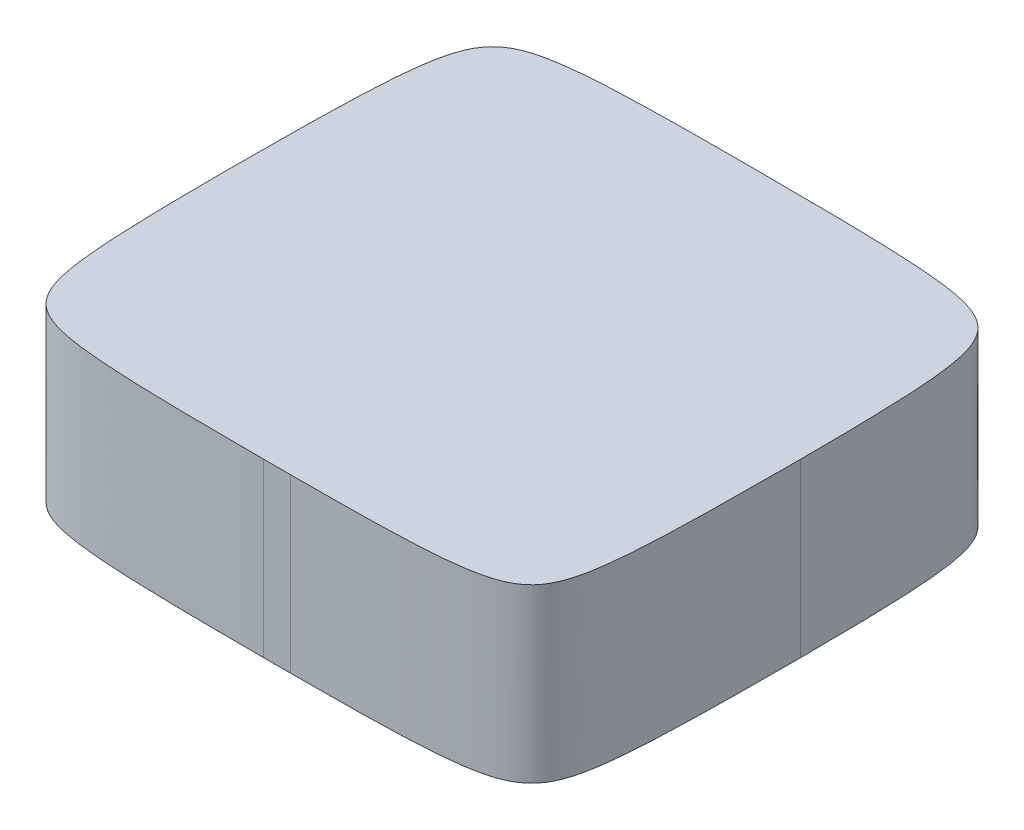
ISO-10303-21;
HEADER;
FILE_DESCRIPTION(('STEP AP214'),'2;1');
FILE_NAME('part.step','',(''),(''),'','','');
FILE_SCHEMA(('AUTOMOTIVE_DESIGN { 1 0 10303 214 1 1 1 1 }'));
ENDSEC;
DATA;
#1=APPLICATION_CONTEXT('core data for automotive mechanical design processes');
#2=APPLICATION_PROTOCOL_DEFINITION('international standard','automotive_design',2000,#1);
#3=PRODUCT_CONTEXT('',#1,'mechanical');
#4=PRODUCT('Part','Part','',(#3));
#5=PRODUCT_RELATED_PRODUCT_CATEGORY('part','',(#4));
#6=PRODUCT_DEFINITION_FORMATION('','',#4);
#7=PRODUCT_DEFINITION_CONTEXT('part definition',#1,'design');
#8=PRODUCT_DEFINITION('design','',#6,#7);
#9=PRODUCT_DEFINITION_SHAPE('','',#8);
#10=(LENGTH_UNIT() NAMED_UNIT(*) SI_UNIT(.MILLI.,.METRE.));
#11=(NAMED_UNIT(*) PLANE_ANGLE_UNIT() SI_UNIT($,.RADIAN.));
#12=(NAMED_UNIT(*) SI_UNIT($,.STERADIAN.) SOLID_ANGLE_UNIT());
#13=UNCERTAINTY_MEASURE_WITH_UNIT(LENGTH_MEASURE(1.E-05),#10,'distance_accuracy_value','');
#14=(GEOMETRIC_REPRESENTATION_CONTEXT(3) GLOBAL_UNCERTAINTY_ASSIGNED_CONTEXT((#13)) GLOBAL_UNIT_ASSIGNED_CONTEXT((#10,
#11,#12)) REPRESENTATION_CONTEXT('',''));
#15=CARTESIAN_POINT('',(0.,0.,0.));
#16=DIRECTION('',(0.,0.,1.));
#17=DIRECTION('',(1.,0.,0.));
#18=AXIS2_PLACEMENT_3D('',#15,#16,#17);
#19=CARTESIAN_POINT('',(0.,25.6,0.));
#20=DIRECTION('',(0.,0.,-1.));
#21=DIRECTION('',(-1.,0.,0.));
#22=AXIS2_PLACEMENT_3D('',#19,#20,#21);
#23=PLANE('',#22);
#24=DIRECTION('',(1.,0.,0.));
#25=VECTOR('',#24,1.);
#26=CARTESIAN_POINT('',(0.,0.,0.));
#27=LINE('',#26,#25);
#28=CARTESIAN_POINT('',(40.,0.,0.));
#29=VERTEX_POINT('',#28);
#30=CARTESIAN_POINT('',(44.,0.,0.));
#31=VERTEX_POINT('',#30);
#32=EDGE_CURVE('E166',#29,#31,#27,.T.);
#33=ORIENTED_EDGE('',*,*,#32,.T.);
#34=CARTESIAN_POINT('',(44.,26.88,0.));
#35=CARTESIAN_POINT('',(44.,17.4933333333333,0.));
#36=CARTESIAN_POINT('',(44.,8.10666666666666,0.));
#37=CARTESIAN_POINT('',(44.,-1.28,0.));
#38=(BOUNDED_CURVE() B_SPLINE_CURVE(3,(#34,#35,#36,#37),.UNSPECIFIED.,.F.,
.F.) B_SPLINE_CURVE_WITH_KNOTS((4,4),(-0.00128,0.02688),
.UNSPECIFIED.) CURVE() GEOMETRIC_REPRESENTATION_ITEM() RATIONAL_B_SPLINE_CURVE((1.,1.,1.,1.)) REPRESENTATION_ITEM(''));
#39=CARTESIAN_POINT('',(44.,25.6,0.));
#40=VERTEX_POINT('',#39);
#41=EDGE_CURVE('E403',#31,#40,#38,.F.);
#42=ORIENTED_EDGE('',*,*,#41,.T.);
#43=DIRECTION('',(1.,0.,0.));
#44=VECTOR('',#43,1.);
#45=CARTESIAN_POINT('',(0.,25.6,0.));
#46=LINE('',#45,#44);
#47=CARTESIAN_POINT('',(40.,25.6,0.));
#48=VERTEX_POINT('',#47);
#49=EDGE_CURVE('E176',#48,#40,#46,.T.);
#50=ORIENTED_EDGE('',*,*,#49,.F.);
#51=CARTESIAN_POINT('',(40.,-1.28,0.));
#52=CARTESIAN_POINT('',(40.,8.10666666666666,0.));
#53=CARTESIAN_POINT('',(40.,17.4933333333333,0.));
#54=CARTESIAN_POINT('',(40.,26.88,0.));
#55=(BOUNDED_CURVE() B_SPLINE_CURVE(3,(#51,#52,#53,#54),.UNSPECIFIED.,.F.,
.F.) B_SPLINE_CURVE_WITH_KNOTS((4,4),(-0.00128,0.02688),
.UNSPECIFIED.) CURVE() GEOMETRIC_REPRESENTATION_ITEM() RATIONAL_B_SPLINE_CURVE((1.,1.,1.,1.)) REPRESENTATION_ITEM(''));
#56=EDGE_CURVE('E192',#48,#29,#55,.F.);
#57=ORIENTED_EDGE('',*,*,#56,.T.);
#58=EDGE_LOOP('',(#33,#42,#50,#57));
#59=FACE_BOUND('',#58,.T.);
#60=ADVANCED_FACE('F41',(#59),#23,.F.);
#61=CARTESIAN_POINT('',(0.,25.6,-74.));
#62=DIRECTION('',(0.,0.,1.));
#63=DIRECTION('',(1.,0.,0.));
#64=AXIS2_PLACEMENT_3D('',#61,#62,#63);
#65=PLANE('',#64);
#66=DIRECTION('',(-1.,0.,0.));
#67=VECTOR('',#66,1.);
#68=CARTESIAN_POINT('',(0.,25.6,-74.));
#69=LINE('',#68,#67);
#70=CARTESIAN_POINT('',(40.,25.6,-74.));
#71=VERTEX_POINT('',#70);
#72=CARTESIAN_POINT('',(36.,25.6,-74.));
#73=VERTEX_POINT('',#72);
#74=EDGE_CURVE('E221',#71,#73,#69,.T.);
#75=ORIENTED_EDGE('',*,*,#74,.F.);
#76=CARTESIAN_POINT('',(40.,-1.28,-74.));
#77=CARTESIAN_POINT('',(40.,8.10666666666666,-74.));
#78=CARTESIAN_POINT('',(40.,17.4933333333333,-74.));
#79=CARTESIAN_POINT('',(40.,26.88,-74.));
#80=(BOUNDED_CURVE() B_SPLINE_CURVE(3,(#76,#77,#78,#79),.UNSPECIFIED.,.F.,
.F.) B_SPLINE_CURVE_WITH_KNOTS((4,4),(-0.00128,0.02688),
.UNSPECIFIED.) CURVE() GEOMETRIC_REPRESENTATION_ITEM() RATIONAL_B_SPLINE_CURVE((1.,1.,1.,1.)) REPRESENTATION_ITEM(''));
#81=CARTESIAN_POINT('',(40.,0.,-74.));
#82=VERTEX_POINT('',#81);
#83=EDGE_CURVE('E12',#71,#82,#80,.F.);
#84=ORIENTED_EDGE('',*,*,#83,.T.);
#85=DIRECTION('',(-1.,0.,0.));
#86=VECTOR('',#85,1.);
#87=CARTESIAN_POINT('',(0.,0.,-74.));
#88=LINE('',#87,#86);
#89=CARTESIAN_POINT('',(36.,0.,-74.));
#90=VERTEX_POINT('',#89);
#91=EDGE_CURVE('E401',#82,#90,#88,.T.);
#92=ORIENTED_EDGE('',*,*,#91,.T.);
#93=CARTESIAN_POINT('',(36.,26.88,-74.));
#94=CARTESIAN_POINT('',(36.,17.4933333333333,-74.));
#95=CARTESIAN_POINT('',(36.,8.10666666666666,-74.));
#96=CARTESIAN_POINT('',(36.,-1.28,-74.));
#97=(BOUNDED_CURVE() B_SPLINE_CURVE(3,(#93,#94,#95,#96),.UNSPECIFIED.,.F.,
.F.) B_SPLINE_CURVE_WITH_KNOTS((4,4),(-0.00128,0.02688),
.UNSPECIFIED.) CURVE() GEOMETRIC_REPRESENTATION_ITEM() RATIONAL_B_SPLINE_CURVE((1.,1.,1.,1.)) REPRESENTATION_ITEM(''));
#98=EDGE_CURVE('E56',#90,#73,#97,.F.);
#99=ORIENTED_EDGE('',*,*,#98,.T.);
#100=EDGE_LOOP('',(#75,#84,#92,#99));
#101=FACE_BOUND('',#100,.T.);
#102=ADVANCED_FACE('F209',(#101),#65,.F.);
#103=CARTESIAN_POINT('',(0.,25.6,0.));
#104=DIRECTION('',(0.,-1.,0.));
#105=DIRECTION('',(0.,0.,-1.));
#106=AXIS2_PLACEMENT_3D('',#103,#104,#105);
#107=PLANE('',#106);
#108=ORIENTED_EDGE('',*,*,#49,.T.);
#109=CARTESIAN_POINT('',(80.,25.6,-40.));
#110=CARTESIAN_POINT('',(80.,25.6,0.));
#111=CARTESIAN_POINT('',(44.,25.6,0.));
#112=(BOUNDED_CURVE() B_SPLINE_CURVE(2,(#109,#110,#111),.UNSPECIFIED.,.F.,
.F.) B_SPLINE_CURVE_WITH_KNOTS((3,3),(0.,1.),
.UNSPECIFIED.) CURVE() GEOMETRIC_REPRESENTATION_ITEM() RATIONAL_B_SPLINE_CURVE((1.,
4.00000000000001,1.)) REPRESENTATION_ITEM(''));
#113=CARTESIAN_POINT('',(79.9992611032174,25.6,-38.0000264663968));
#114=VERTEX_POINT('',#113);
#115=EDGE_CURVE('E402',#40,#114,#112,.F.);
#116=ORIENTED_EDGE('',*,*,#115,.T.);
#117=CARTESIAN_POINT('',(80.,25.6,-40.));
#118=CARTESIAN_POINT('',(80.,25.6,0.));
#119=CARTESIAN_POINT('',(44.,25.6,0.));
#120=(BOUNDED_CURVE() B_SPLINE_CURVE(2,(#117,#118,#119),.UNSPECIFIED.,.F.,
.F.) B_SPLINE_CURVE_WITH_KNOTS((3,3),(0.,1.),
.UNSPECIFIED.) CURVE() GEOMETRIC_REPRESENTATION_ITEM() RATIONAL_B_SPLINE_CURVE((1.,
4.00000000000001,1.)) REPRESENTATION_ITEM(''));
#121=CARTESIAN_POINT('',(80.,25.6,-39.9999892723376));
#122=VERTEX_POINT('',#121);
#123=EDGE_CURVE('E180',#114,#122,#120,.F.);
#124=ORIENTED_EDGE('',*,*,#123,.T.);
#125=CARTESIAN_POINT('',(40.,25.6,-74.));
#126=CARTESIAN_POINT('',(80.,25.6,-74.));
#127=CARTESIAN_POINT('',(80.,25.6,-38.));
#128=(BOUNDED_CURVE() B_SPLINE_CURVE(2,(#125,#126,#127),.UNSPECIFIED.,.F.,
.F.) B_SPLINE_CURVE_WITH_KNOTS((3,3),(0.,1.),
.UNSPECIFIED.) CURVE() GEOMETRIC_REPRESENTATION_ITEM() RATIONAL_B_SPLINE_CURVE((1.,
4.00000000000001,1.)) REPRESENTATION_ITEM(''));
#129=EDGE_CURVE('E70',#122,#71,#128,.F.);
#130=ORIENTED_EDGE('',*,*,#129,.T.);
#131=ORIENTED_EDGE('',*,*,#74,.T.);
#132=CARTESIAN_POINT('',(0.,25.6,-34.));
#133=CARTESIAN_POINT('',(0.,25.6,-74.));
#134=CARTESIAN_POINT('',(36.,25.6,-74.));
#135=(BOUNDED_CURVE() B_SPLINE_CURVE(2,(#132,#133,#134),.UNSPECIFIED.,.F.,
.F.) B_SPLINE_CURVE_WITH_KNOTS((3,3),(0.,1.),
.UNSPECIFIED.) CURVE() GEOMETRIC_REPRESENTATION_ITEM() RATIONAL_B_SPLINE_CURVE((1.,
4.00000000000001,1.)) REPRESENTATION_ITEM(''));
#136=CARTESIAN_POINT('',(0.,25.6,-35.999986712416));
#137=VERTEX_POINT('',#136);
#138=EDGE_CURVE('E231',#73,#137,#135,.F.);
#139=ORIENTED_EDGE('',*,*,#138,.T.);
#140=CARTESIAN_POINT('',(40.,25.6,0.));
#141=CARTESIAN_POINT('',(0.,25.6,0.));
#142=CARTESIAN_POINT('',(0.,25.6,-36.));
#143=(BOUNDED_CURVE() B_SPLINE_CURVE(2,(#140,#141,#142),.UNSPECIFIED.,.F.,
.F.) B_SPLINE_CURVE_WITH_KNOTS((3,3),(0.,1.),
.UNSPECIFIED.) CURVE() GEOMETRIC_REPRESENTATION_ITEM() RATIONAL_B_SPLINE_CURVE((1.,
4.00000000000001,1.)) REPRESENTATION_ITEM(''));
#144=CARTESIAN_POINT('',(0.00101934692222706,25.6,-34.0000211857613));
#145=VERTEX_POINT('',#144);
#146=EDGE_CURVE('E181',#137,#145,#143,.F.);
#147=ORIENTED_EDGE('',*,*,#146,.T.);
#148=CARTESIAN_POINT('',(40.,25.6,0.));
#149=CARTESIAN_POINT('',(0.,25.6,0.));
#150=CARTESIAN_POINT('',(0.,25.6,-36.));
#151=(BOUNDED_CURVE() B_SPLINE_CURVE(2,(#148,#149,#150),.UNSPECIFIED.,.F.,
.F.) B_SPLINE_CURVE_WITH_KNOTS((3,3),(0.,1.),
.UNSPECIFIED.) CURVE() GEOMETRIC_REPRESENTATION_ITEM() RATIONAL_B_SPLINE_CURVE((1.,
4.00000000000001,1.)) REPRESENTATION_ITEM(''));
#152=EDGE_CURVE('E400',#145,#48,#151,.F.);
#153=ORIENTED_EDGE('',*,*,#152,.T.);
#154=EDGE_LOOP('',(#108,#116,#124,#130,#131,#139,#147,#153));
#155=FACE_BOUND('',#154,.T.);
#156=ADVANCED_FACE('F237',(#155),#107,.F.);
#157=CARTESIAN_POINT('',(0.,0.,0.));
#158=DIRECTION('',(0.,-1.,0.));
#159=DIRECTION('',(0.,0.,-1.));
#160=AXIS2_PLACEMENT_3D('',#157,#158,#159);
#161=PLANE('',#160);
#162=CARTESIAN_POINT('',(40.,0.,-37.));
#163=DIRECTION('',(0.,-1.,0.));
#164=DIRECTION('',(0.,0.,-1.));
#165=AXIS2_PLACEMENT_3D('',#162,#163,#164);
#166=CIRCLE('',#165,9.);
#167=CARTESIAN_POINT('',(44.1231056256176,0.,-45.));
#168=VERTEX_POINT('',#167);
#169=CARTESIAN_POINT('',(44.1231056256177,0.,-29.));
#170=VERTEX_POINT('',#169);
#171=EDGE_CURVE('E162',#168,#170,#166,.T.);
#172=ORIENTED_EDGE('',*,*,#171,.F.);
#173=DIRECTION('',(1.,0.,0.));
#174=VECTOR('',#173,1.);
#175=CARTESIAN_POINT('',(35.8768943743824,0.,-45.));
#176=LINE('',#175,#174);
#177=CARTESIAN_POINT('',(35.8768943743824,0.,-45.));
#178=VERTEX_POINT('',#177);
#179=EDGE_CURVE('E159',#178,#168,#176,.T.);
#180=ORIENTED_EDGE('',*,*,#179,.F.);
#181=CARTESIAN_POINT('',(40.,0.,-37.));
#182=DIRECTION('',(0.,-1.,0.));
#183=DIRECTION('',(0.,0.,-1.));
#184=AXIS2_PLACEMENT_3D('',#181,#182,#183);
#185=CIRCLE('',#184,9.);
#186=CARTESIAN_POINT('',(35.8768943743823,0.,-29.));
#187=VERTEX_POINT('',#186);
#188=EDGE_CURVE('E529',#187,#178,#185,.T.);
#189=ORIENTED_EDGE('',*,*,#188,.F.);
#190=DIRECTION('',(-1.,0.,0.));
#191=VECTOR('',#190,1.);
#192=CARTESIAN_POINT('',(44.1231056256177,0.,-29.));
#193=LINE('',#192,#191);
#194=EDGE_CURVE('E527',#170,#187,#193,.T.);
#195=ORIENTED_EDGE('',*,*,#194,.F.);
#196=EDGE_LOOP('',(#172,#180,#189,#195));
#197=FACE_BOUND('',#196,.T.);
#198=CARTESIAN_POINT('',(44.,0.,0.));
#199=CARTESIAN_POINT('',(80.,0.,0.));
#200=CARTESIAN_POINT('',(80.,0.,-40.));
#201=(BOUNDED_CURVE() B_SPLINE_CURVE(2,(#198,#199,#200),.UNSPECIFIED.,.F.,
.F.) B_SPLINE_CURVE_WITH_KNOTS((3,3),(0.,1.),
.UNSPECIFIED.) CURVE() GEOMETRIC_REPRESENTATION_ITEM() RATIONAL_B_SPLINE_CURVE((1.,
4.00000000000001,1.)) REPRESENTATION_ITEM(''));
#202=CARTESIAN_POINT('',(79.9992610911672,0.,-38.0000105614068));
#203=VERTEX_POINT('',#202);
#204=CARTESIAN_POINT('',(80.,0.,-39.999979682261));
#205=VERTEX_POINT('',#204);
#206=EDGE_CURVE('E277',#203,#205,#201,.T.);
#207=ORIENTED_EDGE('',*,*,#206,.F.);
#208=CARTESIAN_POINT('',(44.,0.,0.));
#209=CARTESIAN_POINT('',(80.,0.,0.));
#210=CARTESIAN_POINT('',(80.,0.,-40.));
#211=(BOUNDED_CURVE() B_SPLINE_CURVE(2,(#208,#209,#210),.UNSPECIFIED.,.F.,
.F.) B_SPLINE_CURVE_WITH_KNOTS((3,3),(0.,1.),
.UNSPECIFIED.) CURVE() GEOMETRIC_REPRESENTATION_ITEM() RATIONAL_B_SPLINE_CURVE((1.,
4.00000000000001,1.)) REPRESENTATION_ITEM(''));
#212=EDGE_CURVE('E405',#203,#31,#211,.F.);
#213=ORIENTED_EDGE('',*,*,#212,.T.);
#214=ORIENTED_EDGE('',*,*,#32,.F.);
#215=CARTESIAN_POINT('',(0.,0.,-36.));
#216=CARTESIAN_POINT('',(0.,0.,0.));
#217=CARTESIAN_POINT('',(40.,0.,0.));
#218=(BOUNDED_CURVE() B_SPLINE_CURVE(2,(#215,#216,#217),.UNSPECIFIED.,.F.,
.F.) B_SPLINE_CURVE_WITH_KNOTS((3,3),(0.,1.),
.UNSPECIFIED.) CURVE() GEOMETRIC_REPRESENTATION_ITEM() RATIONAL_B_SPLINE_CURVE((1.,
4.00000000000001,1.)) REPRESENTATION_ITEM(''));
#219=CARTESIAN_POINT('',(0.00101932682637353,0.,-34.0000403604117));
#220=VERTEX_POINT('',#219);
#221=EDGE_CURVE('E407',#29,#220,#218,.F.);
#222=ORIENTED_EDGE('',*,*,#221,.T.);
#223=CARTESIAN_POINT('',(0.,0.,-36.));
#224=CARTESIAN_POINT('',(0.,0.,0.));
#225=CARTESIAN_POINT('',(40.,0.,0.));
#226=(BOUNDED_CURVE() B_SPLINE_CURVE(2,(#223,#224,#225),.UNSPECIFIED.,.F.,
.F.) B_SPLINE_CURVE_WITH_KNOTS((3,3),(0.,1.),
.UNSPECIFIED.) CURVE() GEOMETRIC_REPRESENTATION_ITEM() RATIONAL_B_SPLINE_CURVE((1.,
4.00000000000001,1.)) REPRESENTATION_ITEM(''));
#227=CARTESIAN_POINT('',(0.,0.,-35.9999946657292));
#228=VERTEX_POINT('',#227);
#229=EDGE_CURVE('E163',#228,#220,#226,.T.);
#230=ORIENTED_EDGE('',*,*,#229,.F.);
#231=CARTESIAN_POINT('',(36.,0.,-74.));
#232=CARTESIAN_POINT('',(0.,0.,-74.));
#233=CARTESIAN_POINT('',(0.,0.,-34.));
#234=(BOUNDED_CURVE() B_SPLINE_CURVE(2,(#231,#232,#233),.UNSPECIFIED.,.F.,
.F.) B_SPLINE_CURVE_WITH_KNOTS((3,3),(0.,1.),
.UNSPECIFIED.) CURVE() GEOMETRIC_REPRESENTATION_ITEM() RATIONAL_B_SPLINE_CURVE((1.,
4.00000000000001,1.)) REPRESENTATION_ITEM(''));
#235=EDGE_CURVE('E228',#228,#90,#234,.F.);
#236=ORIENTED_EDGE('',*,*,#235,.T.);
#237=ORIENTED_EDGE('',*,*,#91,.F.);
#238=CARTESIAN_POINT('',(80.,0.,-38.));
#239=CARTESIAN_POINT('',(80.,0.,-74.));
#240=CARTESIAN_POINT('',(40.,0.,-74.));
#241=(BOUNDED_CURVE() B_SPLINE_CURVE(2,(#238,#239,#240),.UNSPECIFIED.,.F.,
.F.) B_SPLINE_CURVE_WITH_KNOTS((3,3),(0.,1.),
.UNSPECIFIED.) CURVE() GEOMETRIC_REPRESENTATION_ITEM() RATIONAL_B_SPLINE_CURVE((1.,
4.00000000000001,1.)) REPRESENTATION_ITEM(''));
#242=EDGE_CURVE('E406',#82,#205,#241,.F.);
#243=ORIENTED_EDGE('',*,*,#242,.T.);
#244=EDGE_LOOP('',(#207,#213,#214,#222,#230,#236,#237,#243));
#245=FACE_BOUND('',#244,.T.);
#246=ADVANCED_FACE('F246',(#197,#245),#161,.T.);
#247=CARTESIAN_POINT('',(40.,-20.,-37.));
#248=DIRECTION('',(0.,1.,0.));
#249=DIRECTION('',(0.,0.,1.));
#250=AXIS2_PLACEMENT_3D('',#247,#248,#249);
#251=CYLINDRICAL_SURFACE('',#250,9.);
#252=ORIENTED_EDGE('',*,*,#171,.T.);
#253=DIRECTION('',(0.,1.,0.));
#254=VECTOR('',#253,1.);
#255=CARTESIAN_POINT('',(44.1231056256177,-20.,-29.));
#256=LINE('',#255,#254);
#257=CARTESIAN_POINT('',(44.1231056256177,-20.,-29.));
#258=VERTEX_POINT('',#257);
#259=EDGE_CURVE('E143',#258,#170,#256,.T.);
#260=ORIENTED_EDGE('',*,*,#259,.F.);
#261=CARTESIAN_POINT('',(40.,-20.,-37.));
#262=DIRECTION('',(0.,-1.,0.));
#263=DIRECTION('',(0.,0.,-1.));
#264=AXIS2_PLACEMENT_3D('',#261,#262,#263);
#265=CIRCLE('',#264,9.);
#266=CARTESIAN_POINT('',(44.1231056256176,-20.,-45.));
#267=VERTEX_POINT('',#266);
#268=EDGE_CURVE('E150',#267,#258,#265,.T.);
#269=ORIENTED_EDGE('',*,*,#268,.F.);
#270=DIRECTION('',(0.,1.,0.));
#271=VECTOR('',#270,1.);
#272=CARTESIAN_POINT('',(44.1231056256176,-20.,-45.));
#273=LINE('',#272,#271);
#274=EDGE_CURVE('E538',#267,#168,#273,.T.);
#275=ORIENTED_EDGE('',*,*,#274,.T.);
#276=EDGE_LOOP('',(#252,#260,#269,#275));
#277=FACE_BOUND('',#276,.T.);
#278=ADVANCED_FACE('F161',(#277),#251,.T.);
#279=CARTESIAN_POINT('',(44.1231056256177,-20.,-29.));
#280=DIRECTION('',(0.,0.,-1.));
#281=DIRECTION('',(-1.,0.,0.));
#282=AXIS2_PLACEMENT_3D('',#279,#280,#281);
#283=PLANE('',#282);
#284=ORIENTED_EDGE('',*,*,#194,.T.);
#285=DIRECTION('',(0.,1.,0.));
#286=VECTOR('',#285,1.);
#287=CARTESIAN_POINT('',(35.8768943743823,-20.,-29.));
#288=LINE('',#287,#286);
#289=CARTESIAN_POINT('',(35.8768943743823,-20.,-29.));
#290=VERTEX_POINT('',#289);
#291=EDGE_CURVE('E146',#290,#187,#288,.T.);
#292=ORIENTED_EDGE('',*,*,#291,.F.);
#293=DIRECTION('',(-1.,0.,0.));
#294=VECTOR('',#293,1.);
#295=CARTESIAN_POINT('',(44.1231056256177,-20.,-29.));
#296=LINE('',#295,#294);
#297=EDGE_CURVE('E138',#258,#290,#296,.T.);
#298=ORIENTED_EDGE('',*,*,#297,.F.);
#299=ORIENTED_EDGE('',*,*,#259,.T.);
#300=EDGE_LOOP('',(#284,#292,#298,#299));
#301=FACE_BOUND('',#300,.T.);
#302=ADVANCED_FACE('F141',(#301),#283,.F.);
#303=CARTESIAN_POINT('',(40.,-20.,-37.));
#304=DIRECTION('',(0.,1.,0.));
#305=DIRECTION('',(0.,0.,1.));
#306=AXIS2_PLACEMENT_3D('',#303,#304,#305);
#307=CYLINDRICAL_SURFACE('',#306,9.);
#308=ORIENTED_EDGE('',*,*,#188,.T.);
#309=DIRECTION('',(0.,1.,0.));
#310=VECTOR('',#309,1.);
#311=CARTESIAN_POINT('',(35.8768943743824,-20.,-45.));
#312=LINE('',#311,#310);
#313=CARTESIAN_POINT('',(35.8768943743824,-20.,-45.));
#314=VERTEX_POINT('',#313);
#315=EDGE_CURVE('E167',#314,#178,#312,.T.);
#316=ORIENTED_EDGE('',*,*,#315,.F.);
#317=CARTESIAN_POINT('',(40.,-20.,-37.));
#318=DIRECTION('',(0.,-1.,0.));
#319=DIRECTION('',(0.,0.,-1.));
#320=AXIS2_PLACEMENT_3D('',#317,#318,#319);
#321=CIRCLE('',#320,9.);
#322=EDGE_CURVE('E149',#290,#314,#321,.T.);
#323=ORIENTED_EDGE('',*,*,#322,.F.);
#324=ORIENTED_EDGE('',*,*,#291,.T.);
#325=EDGE_LOOP('',(#308,#316,#323,#324));
#326=FACE_BOUND('',#325,.T.);
#327=ADVANCED_FACE('F544',(#326),#307,.T.);
#328=CARTESIAN_POINT('',(35.8768943743824,-20.,-45.));
#329=DIRECTION('',(0.,0.,1.));
#330=DIRECTION('',(1.,0.,0.));
#331=AXIS2_PLACEMENT_3D('',#328,#329,#330);
#332=PLANE('',#331);
#333=ORIENTED_EDGE('',*,*,#179,.T.);
#334=ORIENTED_EDGE('',*,*,#274,.F.);
#335=DIRECTION('',(1.,0.,0.));
#336=VECTOR('',#335,1.);
#337=CARTESIAN_POINT('',(35.8768943743824,-20.,-45.));
#338=LINE('',#337,#336);
#339=EDGE_CURVE('E155',#314,#267,#338,.T.);
#340=ORIENTED_EDGE('',*,*,#339,.F.);
#341=ORIENTED_EDGE('',*,*,#315,.T.);
#342=EDGE_LOOP('',(#333,#334,#340,#341));
#343=FACE_BOUND('',#342,.T.);
#344=ADVANCED_FACE('F542',(#343),#332,.F.);
#345=CARTESIAN_POINT('',(40.,-20.,-37.));
#346=DIRECTION('',(0.,-1.,0.));
#347=DIRECTION('',(0.,0.,-1.));
#348=AXIS2_PLACEMENT_3D('',#345,#346,#347);
#349=PLANE('',#348);
#350=ORIENTED_EDGE('',*,*,#268,.T.);
#351=ORIENTED_EDGE('',*,*,#297,.T.);
#352=ORIENTED_EDGE('',*,*,#322,.T.);
#353=ORIENTED_EDGE('',*,*,#339,.T.);
#354=EDGE_LOOP('',(#350,#351,#352,#353));
#355=FACE_BOUND('',#354,.T.);
#356=ADVANCED_FACE('F153',(#355),#349,.T.);
#357=CARTESIAN_POINT('',(40.,26.88,-74.));
#358=CARTESIAN_POINT('',(40.,17.4933333333333,-74.));
#359=CARTESIAN_POINT('',(40.,8.10666666666666,-74.));
#360=CARTESIAN_POINT('',(40.,-1.28,-74.));
#361=CARTESIAN_POINT('',(80.,26.88,-74.));
#362=CARTESIAN_POINT('',(80.,17.4933333333333,-74.));
#363=CARTESIAN_POINT('',(80.,8.10666666666666,-74.));
#364=CARTESIAN_POINT('',(80.,-1.28,-74.));
#365=CARTESIAN_POINT('',(80.,26.88,-38.));
#366=CARTESIAN_POINT('',(80.,17.4933333333333,-38.));
#367=CARTESIAN_POINT('',(80.,8.10666666666666,-38.));
#368=CARTESIAN_POINT('',(80.,-1.28,-38.));
#369=(BOUNDED_SURFACE() B_SPLINE_SURFACE(2,3,((#357,#358,#359,#360),(#361,#362,#363,#364),(#365,
#366,#367,#368)),.UNSPECIFIED.,.F.,.F.,.F.) B_SPLINE_SURFACE_WITH_KNOTS((3,3),(4,4),(0.,1.),
(-0.00128,0.02688),
.UNSPECIFIED.) GEOMETRIC_REPRESENTATION_ITEM() RATIONAL_B_SPLINE_SURFACE(((1.,1.,1.,1.),
(4.00000000000001,4.00000000000001,4.00000000000001,4.00000000000001),(1.,1.,1.,1.))) REPRESENTATION_ITEM('') SURFACE());
#370=CARTESIAN_POINT('',(80.,-1.28,-40.));
#371=CARTESIAN_POINT('',(80.,8.10666666666666,-40.));
#372=CARTESIAN_POINT('',(80.,17.4933333333333,-40.));
#373=CARTESIAN_POINT('',(80.,26.88,-40.));
#374=(BOUNDED_CURVE() B_SPLINE_CURVE(3,(#370,#371,#372,#373),.UNSPECIFIED.,.F.,
.F.) B_SPLINE_CURVE_WITH_KNOTS((4,4),(-0.00128,0.02688),
.UNSPECIFIED.) CURVE() GEOMETRIC_REPRESENTATION_ITEM() RATIONAL_B_SPLINE_CURVE((1.,1.,1.,1.)) REPRESENTATION_ITEM(''));
#375=EDGE_CURVE('E466',#205,#122,#374,.T.);
#376=ORIENTED_EDGE('',*,*,#83,.F.);
#377=ORIENTED_EDGE('',*,*,#129,.F.);
#378=ORIENTED_EDGE('',*,*,#375,.F.);
#379=ORIENTED_EDGE('',*,*,#242,.F.);
#380=EDGE_LOOP('',(#376,#377,#378,#379));
#381=FACE_BOUND('',#380,.T.);
#382=ADVANCED_FACE('F308',(#381),#369,.T.);
#383=CARTESIAN_POINT('',(80.,26.88,-40.));
#384=CARTESIAN_POINT('',(80.,17.4933333333333,-40.));
#385=CARTESIAN_POINT('',(80.,8.10666666666666,-40.));
#386=CARTESIAN_POINT('',(80.,-1.28,-40.));
#387=CARTESIAN_POINT('',(80.,26.88,0.));
#388=CARTESIAN_POINT('',(80.,17.4933333333333,0.));
#389=CARTESIAN_POINT('',(80.,8.10666666666666,0.));
#390=CARTESIAN_POINT('',(80.,-1.28,0.));
#391=CARTESIAN_POINT('',(44.,26.88,0.));
#392=CARTESIAN_POINT('',(44.,17.4933333333333,0.));
#393=CARTESIAN_POINT('',(44.,8.10666666666666,0.));
#394=CARTESIAN_POINT('',(44.,-1.28,0.));
#395=(BOUNDED_SURFACE() B_SPLINE_SURFACE(2,3,((#383,#384,#385,#386),(#387,#388,#389,#390),(#391,
#392,#393,#394)),.UNSPECIFIED.,.F.,.F.,.F.) B_SPLINE_SURFACE_WITH_KNOTS((3,3),(4,4),(0.,1.),
(-0.00128,0.02688),
.UNSPECIFIED.) GEOMETRIC_REPRESENTATION_ITEM() RATIONAL_B_SPLINE_SURFACE(((1.,1.,1.,1.),
(4.00000000000001,4.00000000000001,4.00000000000001,4.00000000000001),(1.,1.,1.,1.))) REPRESENTATION_ITEM('') SURFACE());
#396=ORIENTED_EDGE('',*,*,#115,.F.);
#397=ORIENTED_EDGE('',*,*,#41,.F.);
#398=ORIENTED_EDGE('',*,*,#212,.F.);
#399=ORIENTED_EDGE('',*,*,#206,.T.);
#400=ORIENTED_EDGE('',*,*,#375,.T.);
#401=ORIENTED_EDGE('',*,*,#123,.F.);
#402=EDGE_LOOP('',(#396,#397,#398,#399,#400,#401));
#403=FACE_BOUND('',#402,.T.);
#404=ADVANCED_FACE('F212',(#403),#395,.T.);
#405=CARTESIAN_POINT('',(0.,26.88,-34.));
#406=CARTESIAN_POINT('',(0.,17.4933333333333,-34.));
#407=CARTESIAN_POINT('',(0.,8.10666666666666,-34.));
#408=CARTESIAN_POINT('',(0.,-1.28,-34.));
#409=CARTESIAN_POINT('',(0.,26.88,-74.));
#410=CARTESIAN_POINT('',(0.,17.4933333333333,-74.));
#411=CARTESIAN_POINT('',(0.,8.10666666666666,-74.));
#412=CARTESIAN_POINT('',(0.,-1.28,-74.));
#413=CARTESIAN_POINT('',(36.,26.88,-74.));
#414=CARTESIAN_POINT('',(36.,17.4933333333333,-74.));
#415=CARTESIAN_POINT('',(36.,8.10666666666666,-74.));
#416=CARTESIAN_POINT('',(36.,-1.28,-74.));
#417=(BOUNDED_SURFACE() B_SPLINE_SURFACE(2,3,((#405,#406,#407,#408),(#409,#410,#411,#412),(#413,
#414,#415,#416)),.UNSPECIFIED.,.F.,.F.,.F.) B_SPLINE_SURFACE_WITH_KNOTS((3,3),(4,4),(0.,1.),
(-0.00128,0.02688),
.UNSPECIFIED.) GEOMETRIC_REPRESENTATION_ITEM() RATIONAL_B_SPLINE_SURFACE(((1.,1.,1.,1.),
(4.00000000000001,4.00000000000001,4.00000000000001,4.00000000000001),(1.,1.,1.,1.))) REPRESENTATION_ITEM('') SURFACE());
#418=CARTESIAN_POINT('',(0.,26.88,-36.));
#419=CARTESIAN_POINT('',(0.,17.4933333333333,-36.));
#420=CARTESIAN_POINT('',(0.,8.10666666666666,-36.));
#421=CARTESIAN_POINT('',(0.,-1.28,-36.));
#422=(BOUNDED_CURVE() B_SPLINE_CURVE(3,(#418,#419,#420,#421),.UNSPECIFIED.,.F.,
.F.) B_SPLINE_CURVE_WITH_KNOTS((4,4),(-0.00128,0.02688),
.UNSPECIFIED.) CURVE() GEOMETRIC_REPRESENTATION_ITEM() RATIONAL_B_SPLINE_CURVE((1.,1.,1.,1.)) REPRESENTATION_ITEM(''));
#423=EDGE_CURVE('E344',#137,#228,#422,.T.);
#424=ORIENTED_EDGE('',*,*,#423,.F.);
#425=ORIENTED_EDGE('',*,*,#138,.F.);
#426=ORIENTED_EDGE('',*,*,#98,.F.);
#427=ORIENTED_EDGE('',*,*,#235,.F.);
#428=EDGE_LOOP('',(#424,#425,#426,#427));
#429=FACE_BOUND('',#428,.T.);
#430=ADVANCED_FACE('F44',(#429),#417,.T.);
#431=CARTESIAN_POINT('',(40.,26.88,0.));
#432=CARTESIAN_POINT('',(40.,17.4933333333333,0.));
#433=CARTESIAN_POINT('',(40.,8.10666666666666,0.));
#434=CARTESIAN_POINT('',(40.,-1.28,0.));
#435=CARTESIAN_POINT('',(0.,26.88,0.));
#436=CARTESIAN_POINT('',(0.,17.4933333333333,0.));
#437=CARTESIAN_POINT('',(0.,8.10666666666666,0.));
#438=CARTESIAN_POINT('',(0.,-1.28,0.));
#439=CARTESIAN_POINT('',(0.,26.88,-36.));
#440=CARTESIAN_POINT('',(0.,17.4933333333333,-36.));
#441=CARTESIAN_POINT('',(0.,8.10666666666666,-36.));
#442=CARTESIAN_POINT('',(0.,-1.28,-36.));
#443=(BOUNDED_SURFACE() B_SPLINE_SURFACE(2,3,((#431,#432,#433,#434),(#435,#436,#437,#438),(#439,
#440,#441,#442)),.UNSPECIFIED.,.F.,.F.,.F.) B_SPLINE_SURFACE_WITH_KNOTS((3,3),(4,4),(0.,1.),
(-0.00128,0.02688),
.UNSPECIFIED.) GEOMETRIC_REPRESENTATION_ITEM() RATIONAL_B_SPLINE_SURFACE(((1.,1.,1.,1.),
(4.00000000000001,4.00000000000001,4.00000000000001,4.00000000000001),(1.,1.,1.,1.))) REPRESENTATION_ITEM('') SURFACE());
#444=ORIENTED_EDGE('',*,*,#146,.F.);
#445=ORIENTED_EDGE('',*,*,#423,.T.);
#446=ORIENTED_EDGE('',*,*,#229,.T.);
#447=ORIENTED_EDGE('',*,*,#221,.F.);
#448=ORIENTED_EDGE('',*,*,#56,.F.);
#449=ORIENTED_EDGE('',*,*,#152,.F.);
#450=EDGE_LOOP('',(#444,#445,#446,#447,#448,#449));
#451=FACE_BOUND('',#450,.T.);
#452=ADVANCED_FACE('F295',(#451),#443,.T.);
#453=CLOSED_SHELL('',(#60,#102,#156,#246,#278,#302,#327,#344,#356,#382,#404,#430,#452));
#454=MANIFOLD_SOLID_BREP('B2',#453);
#455=ADVANCED_BREP_SHAPE_REPRESENTATION('',(#18,#454),#14);
#456=SHAPE_DEFINITION_REPRESENTATION(#9,#455);
ENDSEC;
END-ISO-10303-21;
